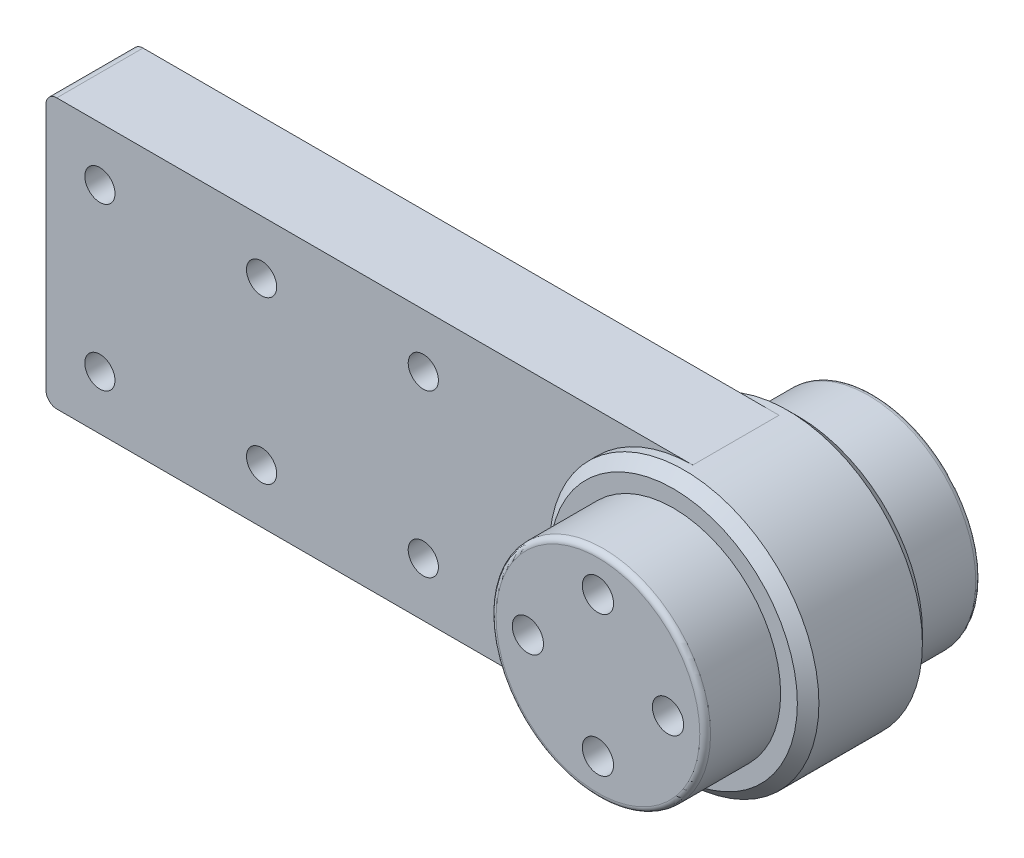
ISO-10303-21;
HEADER;
FILE_DESCRIPTION(('STEP AP214'),'2;1');
FILE_NAME('part.step','',(''),(''),'','','');
FILE_SCHEMA(('AUTOMOTIVE_DESIGN { 1 0 10303 214 1 1 1 1 }'));
ENDSEC;
DATA;
#1=APPLICATION_CONTEXT('core data for automotive mechanical design processes');
#2=APPLICATION_PROTOCOL_DEFINITION('international standard','automotive_design',2000,#1);
#3=PRODUCT_CONTEXT('',#1,'mechanical');
#4=PRODUCT('Part','Part','',(#3));
#5=PRODUCT_RELATED_PRODUCT_CATEGORY('part','',(#4));
#6=PRODUCT_DEFINITION_FORMATION('','',#4);
#7=PRODUCT_DEFINITION_CONTEXT('part definition',#1,'design');
#8=PRODUCT_DEFINITION('design','',#6,#7);
#9=PRODUCT_DEFINITION_SHAPE('','',#8);
#10=(LENGTH_UNIT() NAMED_UNIT(*) SI_UNIT(.MILLI.,.METRE.));
#11=(NAMED_UNIT(*) PLANE_ANGLE_UNIT() SI_UNIT($,.RADIAN.));
#12=(NAMED_UNIT(*) SI_UNIT($,.STERADIAN.) SOLID_ANGLE_UNIT());
#13=UNCERTAINTY_MEASURE_WITH_UNIT(LENGTH_MEASURE(1.E-05),#10,'distance_accuracy_value','');
#14=(GEOMETRIC_REPRESENTATION_CONTEXT(3) GLOBAL_UNCERTAINTY_ASSIGNED_CONTEXT((#13)) GLOBAL_UNIT_ASSIGNED_CONTEXT((#10,
#11,#12)) REPRESENTATION_CONTEXT('',''));
#15=CARTESIAN_POINT('',(0.,0.,0.));
#16=DIRECTION('',(0.,0.,1.));
#17=DIRECTION('',(1.,0.,0.));
#18=AXIS2_PLACEMENT_3D('',#15,#16,#17);
#19=CARTESIAN_POINT('',(9.95,0.,1.8));
#20=DIRECTION('',(0.,0.,-1.));
#21=DIRECTION('',(-1.,0.,0.));
#22=AXIS2_PLACEMENT_3D('',#19,#20,#21);
#23=PLANE('',#22);
#24=CARTESIAN_POINT('',(0.,0.,1.8));
#25=DIRECTION('',(0.,0.,-1.));
#26=DIRECTION('',(-1.,0.,0.));
#27=AXIS2_PLACEMENT_3D('',#24,#25,#26);
#28=CIRCLE('',#27,11.5);
#29=CARTESIAN_POINT('',(-11.5,0.,1.8));
#30=VERTEX_POINT('',#29);
#31=EDGE_CURVE('E155',#30,#30,#28,.T.);
#32=ORIENTED_EDGE('',*,*,#31,.F.);
#33=EDGE_LOOP('',(#32));
#34=FACE_BOUND('',#33,.T.);
#35=CARTESIAN_POINT('',(0.,0.,1.8));
#36=DIRECTION('',(0.,0.,-1.));
#37=DIRECTION('',(-1.,0.,0.));
#38=AXIS2_PLACEMENT_3D('',#35,#36,#37);
#39=CIRCLE('',#38,9.95);
#40=CARTESIAN_POINT('',(-9.95,0.,1.8));
#41=VERTEX_POINT('',#40);
#42=EDGE_CURVE('E146',#41,#41,#39,.T.);
#43=ORIENTED_EDGE('',*,*,#42,.T.);
#44=EDGE_LOOP('',(#43));
#45=FACE_BOUND('',#44,.T.);
#46=ADVANCED_FACE('F37',(#34,#45),#23,.F.);
#47=CARTESIAN_POINT('',(0.,0.,1.8));
#48=DIRECTION('',(0.,0.,-1.));
#49=DIRECTION('',(-1.,0.,0.));
#50=AXIS2_PLACEMENT_3D('',#47,#48,#49);
#51=CONICAL_SURFACE('',#50,11.5,0.785398163397449);
#52=CARTESIAN_POINT('',(0.,0.,0.800000000000002));
#53=DIRECTION('',(0.,0.,-1.));
#54=DIRECTION('',(-1.,0.,0.));
#55=AXIS2_PLACEMENT_3D('',#52,#53,#54);
#56=CIRCLE('',#55,12.5);
#57=CARTESIAN_POINT('',(-12.5,0.,0.800000000000003));
#58=VERTEX_POINT('',#57);
#59=EDGE_CURVE('E152',#58,#58,#56,.T.);
#60=ORIENTED_EDGE('',*,*,#59,.F.);
#61=EDGE_LOOP('',(#60));
#62=FACE_BOUND('',#61,.T.);
#63=ORIENTED_EDGE('',*,*,#31,.T.);
#64=EDGE_LOOP('',(#63));
#65=FACE_BOUND('',#64,.T.);
#66=ADVANCED_FACE('F214',(#62,#65),#51,.T.);
#67=CARTESIAN_POINT('',(0.,0.,0.));
#68=DIRECTION('',(0.,0.,-1.));
#69=DIRECTION('',(-1.,0.,0.));
#70=AXIS2_PLACEMENT_3D('',#67,#68,#69);
#71=CYLINDRICAL_SURFACE('',#70,12.5);
#72=CARTESIAN_POINT('',(0.,0.,0.));
#73=DIRECTION('',(0.,0.,-1.));
#74=DIRECTION('',(-1.,0.,0.));
#75=AXIS2_PLACEMENT_3D('',#72,#73,#74);
#76=CIRCLE('',#75,12.5);
#77=CARTESIAN_POINT('',(0.,-12.5,0.));
#78=VERTEX_POINT('',#77);
#79=CARTESIAN_POINT('',(0.,12.5,0.));
#80=VERTEX_POINT('',#79);
#81=EDGE_CURVE('E150',#78,#80,#76,.T.);
#82=ORIENTED_EDGE('',*,*,#81,.F.);
#83=DIRECTION('',(0.,0.,1.));
#84=VECTOR('',#83,1.);
#85=CARTESIAN_POINT('',(0.,-12.5,-4.));
#86=LINE('',#85,#84);
#87=CARTESIAN_POINT('',(0.,-12.5,-8.));
#88=VERTEX_POINT('',#87);
#89=EDGE_CURVE('E103',#88,#78,#86,.T.);
#90=ORIENTED_EDGE('',*,*,#89,.F.);
#91=CARTESIAN_POINT('',(0.,0.,-8.));
#92=DIRECTION('',(0.,0.,-1.));
#93=DIRECTION('',(-1.,0.,0.));
#94=AXIS2_PLACEMENT_3D('',#91,#92,#93);
#95=CIRCLE('',#94,12.5);
#96=CARTESIAN_POINT('',(0.,12.5,-8.));
#97=VERTEX_POINT('',#96);
#98=EDGE_CURVE('E108',#88,#97,#95,.T.);
#99=ORIENTED_EDGE('',*,*,#98,.T.);
#100=DIRECTION('',(0.,0.,1.));
#101=VECTOR('',#100,1.);
#102=CARTESIAN_POINT('',(0.,12.5,-4.));
#103=LINE('',#102,#101);
#104=EDGE_CURVE('E93',#97,#80,#103,.T.);
#105=ORIENTED_EDGE('',*,*,#104,.T.);
#106=EDGE_LOOP('',(#82,#90,#99,#105));
#107=FACE_BOUND('',#106,.T.);
#108=ORIENTED_EDGE('',*,*,#59,.T.);
#109=EDGE_LOOP('',(#108));
#110=FACE_BOUND('',#109,.T.);
#111=CARTESIAN_POINT('',(0.,0.,-8.8));
#112=DIRECTION('',(0.,0.,-1.));
#113=DIRECTION('',(-1.,0.,0.));
#114=AXIS2_PLACEMENT_3D('',#111,#112,#113);
#115=CIRCLE('',#114,12.5);
#116=CARTESIAN_POINT('',(-12.5,0.,-8.8));
#117=VERTEX_POINT('',#116);
#118=EDGE_CURVE('E116',#117,#117,#115,.T.);
#119=ORIENTED_EDGE('',*,*,#118,.F.);
#120=EDGE_LOOP('',(#119));
#121=FACE_BOUND('',#120,.T.);
#122=ADVANCED_FACE('F113',(#107,#110,#121),#71,.T.);
#123=CARTESIAN_POINT('',(9.95,0.,8.8));
#124=DIRECTION('',(0.,0.,-1.));
#125=DIRECTION('',(-1.,0.,0.));
#126=AXIS2_PLACEMENT_3D('',#123,#124,#125);
#127=PLANE('',#126);
#128=CARTESIAN_POINT('',(0.,0.,8.8));
#129=DIRECTION('',(0.,0.,-1.));
#130=DIRECTION('',(-1.,0.,0.));
#131=AXIS2_PLACEMENT_3D('',#128,#129,#130);
#132=CIRCLE('',#131,9.45);
#133=CARTESIAN_POINT('',(-9.45,0.,8.8));
#134=VERTEX_POINT('',#133);
#135=EDGE_CURVE('E11',#134,#134,#132,.F.);
#136=ORIENTED_EDGE('',*,*,#135,.T.);
#137=EDGE_LOOP('',(#136));
#138=FACE_BOUND('',#137,.T.);
#139=CARTESIAN_POINT('',(0.,6.5,8.8));
#140=DIRECTION('',(0.,0.,1.));
#141=DIRECTION('',(1.,0.,0.));
#142=AXIS2_PLACEMENT_3D('',#139,#140,#141);
#143=CIRCLE('',#142,1.45);
#144=CARTESIAN_POINT('',(1.45,6.5,8.8));
#145=VERTEX_POINT('',#144);
#146=EDGE_CURVE('E130',#145,#145,#143,.T.);
#147=ORIENTED_EDGE('',*,*,#146,.F.);
#148=EDGE_LOOP('',(#147));
#149=FACE_BOUND('',#148,.T.);
#150=CARTESIAN_POINT('',(6.5,0.,8.8));
#151=DIRECTION('',(0.,0.,1.));
#152=DIRECTION('',(1.,0.,0.));
#153=AXIS2_PLACEMENT_3D('',#150,#151,#152);
#154=CIRCLE('',#153,1.45);
#155=CARTESIAN_POINT('',(7.95,0.,8.8));
#156=VERTEX_POINT('',#155);
#157=EDGE_CURVE('E133',#156,#156,#154,.T.);
#158=ORIENTED_EDGE('',*,*,#157,.F.);
#159=EDGE_LOOP('',(#158));
#160=FACE_BOUND('',#159,.T.);
#161=CARTESIAN_POINT('',(0.,-6.5,8.8));
#162=DIRECTION('',(0.,0.,1.));
#163=DIRECTION('',(1.,0.,0.));
#164=AXIS2_PLACEMENT_3D('',#161,#162,#163);
#165=CIRCLE('',#164,1.45);
#166=CARTESIAN_POINT('',(1.45,-6.5,8.8));
#167=VERTEX_POINT('',#166);
#168=EDGE_CURVE('E136',#167,#167,#165,.T.);
#169=ORIENTED_EDGE('',*,*,#168,.F.);
#170=EDGE_LOOP('',(#169));
#171=FACE_BOUND('',#170,.T.);
#172=CARTESIAN_POINT('',(-6.5,0.,8.8));
#173=DIRECTION('',(0.,0.,1.));
#174=DIRECTION('',(1.,0.,0.));
#175=AXIS2_PLACEMENT_3D('',#172,#173,#174);
#176=CIRCLE('',#175,1.45);
#177=CARTESIAN_POINT('',(-5.05,0.,8.8));
#178=VERTEX_POINT('',#177);
#179=EDGE_CURVE('E129',#178,#178,#176,.T.);
#180=ORIENTED_EDGE('',*,*,#179,.F.);
#181=EDGE_LOOP('',(#180));
#182=FACE_BOUND('',#181,.T.);
#183=ADVANCED_FACE('F339',(#138,#149,#160,#171,#182),#127,.F.);
#184=CARTESIAN_POINT('',(0.,0.,0.));
#185=DIRECTION('',(0.,0.,-1.));
#186=DIRECTION('',(-1.,0.,0.));
#187=AXIS2_PLACEMENT_3D('',#184,#185,#186);
#188=CYLINDRICAL_SURFACE('',#187,9.95);
#189=CARTESIAN_POINT('',(0.,0.,8.3));
#190=DIRECTION('',(0.,0.,-1.));
#191=DIRECTION('',(-1.,0.,0.));
#192=AXIS2_PLACEMENT_3D('',#189,#190,#191);
#193=CIRCLE('',#192,9.95);
#194=CARTESIAN_POINT('',(-9.95,0.,8.3));
#195=VERTEX_POINT('',#194);
#196=EDGE_CURVE('E45',#195,#195,#193,.T.);
#197=ORIENTED_EDGE('',*,*,#196,.T.);
#198=EDGE_LOOP('',(#197));
#199=FACE_BOUND('',#198,.T.);
#200=ORIENTED_EDGE('',*,*,#42,.F.);
#201=EDGE_LOOP('',(#200));
#202=FACE_BOUND('',#201,.T.);
#203=ADVANCED_FACE('F201',(#199,#202),#188,.T.);
#204=CARTESIAN_POINT('',(-60.,-12.5,-4.));
#205=DIRECTION('',(0.,-1.,0.));
#206=DIRECTION('',(1.,0.,0.));
#207=AXIS2_PLACEMENT_3D('',#204,#205,#206);
#208=PLANE('',#207);
#209=DIRECTION('',(1.,0.,0.));
#210=VECTOR('',#209,1.);
#211=CARTESIAN_POINT('',(-60.,-12.5,0.));
#212=LINE('',#211,#210);
#213=CARTESIAN_POINT('',(-59.,-12.5,0.));
#214=VERTEX_POINT('',#213);
#215=EDGE_CURVE('E104',#214,#78,#212,.T.);
#216=ORIENTED_EDGE('',*,*,#215,.F.);
#217=DIRECTION('',(0.,0.,1.));
#218=VECTOR('',#217,1.);
#219=CARTESIAN_POINT('',(-59.,-12.5,-4.));
#220=LINE('',#219,#218);
#221=CARTESIAN_POINT('',(-59.,-12.5,-8.));
#222=VERTEX_POINT('',#221);
#223=EDGE_CURVE('E60',#214,#222,#220,.F.);
#224=ORIENTED_EDGE('',*,*,#223,.T.);
#225=DIRECTION('',(1.,0.,0.));
#226=VECTOR('',#225,1.);
#227=CARTESIAN_POINT('',(-60.,-12.5,-8.));
#228=LINE('',#227,#226);
#229=EDGE_CURVE('E123',#222,#88,#228,.T.);
#230=ORIENTED_EDGE('',*,*,#229,.T.);
#231=ORIENTED_EDGE('',*,*,#89,.T.);
#232=EDGE_LOOP('',(#216,#224,#230,#231));
#233=FACE_BOUND('',#232,.T.);
#234=ADVANCED_FACE('F239',(#233),#208,.T.);
#235=CARTESIAN_POINT('',(-60.,12.5,-4.));
#236=DIRECTION('',(-1.,0.,0.));
#237=DIRECTION('',(0.,0.,1.));
#238=AXIS2_PLACEMENT_3D('',#235,#236,#237);
#239=PLANE('',#238);
#240=DIRECTION('',(0.,-1.,0.));
#241=VECTOR('',#240,1.);
#242=CARTESIAN_POINT('',(-60.,12.5,-8.));
#243=LINE('',#242,#241);
#244=CARTESIAN_POINT('',(-60.,11.5,-8.));
#245=VERTEX_POINT('',#244);
#246=CARTESIAN_POINT('',(-60.,-11.5,-8.));
#247=VERTEX_POINT('',#246);
#248=EDGE_CURVE('E109',#245,#247,#243,.T.);
#249=ORIENTED_EDGE('',*,*,#248,.T.);
#250=DIRECTION('',(0.,0.,1.));
#251=VECTOR('',#250,1.);
#252=CARTESIAN_POINT('',(-60.,-11.5,-4.));
#253=LINE('',#252,#251);
#254=CARTESIAN_POINT('',(-60.,-11.5,0.));
#255=VERTEX_POINT('',#254);
#256=EDGE_CURVE('E180',#247,#255,#253,.T.);
#257=ORIENTED_EDGE('',*,*,#256,.T.);
#258=DIRECTION('',(0.,-1.,0.));
#259=VECTOR('',#258,1.);
#260=CARTESIAN_POINT('',(-60.,12.5,0.));
#261=LINE('',#260,#259);
#262=CARTESIAN_POINT('',(-60.,11.5,0.));
#263=VERTEX_POINT('',#262);
#264=EDGE_CURVE('E142',#263,#255,#261,.T.);
#265=ORIENTED_EDGE('',*,*,#264,.F.);
#266=DIRECTION('',(0.,0.,1.));
#267=VECTOR('',#266,1.);
#268=CARTESIAN_POINT('',(-60.,11.5,-4.));
#269=LINE('',#268,#267);
#270=EDGE_CURVE('E158',#263,#245,#269,.F.);
#271=ORIENTED_EDGE('',*,*,#270,.T.);
#272=EDGE_LOOP('',(#249,#257,#265,#271));
#273=FACE_BOUND('',#272,.T.);
#274=ADVANCED_FACE('F331',(#273),#239,.T.);
#275=CARTESIAN_POINT('',(0.,12.5,-4.));
#276=DIRECTION('',(0.,1.,0.));
#277=DIRECTION('',(-1.,0.,0.));
#278=AXIS2_PLACEMENT_3D('',#275,#276,#277);
#279=PLANE('',#278);
#280=DIRECTION('',(-1.,0.,0.));
#281=VECTOR('',#280,1.);
#282=CARTESIAN_POINT('',(0.,12.5,-8.));
#283=LINE('',#282,#281);
#284=CARTESIAN_POINT('',(-59.,12.5,-8.));
#285=VERTEX_POINT('',#284);
#286=EDGE_CURVE('E96',#97,#285,#283,.T.);
#287=ORIENTED_EDGE('',*,*,#286,.T.);
#288=DIRECTION('',(0.,0.,1.));
#289=VECTOR('',#288,1.);
#290=CARTESIAN_POINT('',(-59.,12.5,-4.));
#291=LINE('',#290,#289);
#292=CARTESIAN_POINT('',(-59.,12.5,0.));
#293=VERTEX_POINT('',#292);
#294=EDGE_CURVE('E191',#285,#293,#291,.T.);
#295=ORIENTED_EDGE('',*,*,#294,.T.);
#296=DIRECTION('',(-1.,0.,0.));
#297=VECTOR('',#296,1.);
#298=CARTESIAN_POINT('',(0.,12.5,0.));
#299=LINE('',#298,#297);
#300=EDGE_CURVE('E99',#80,#293,#299,.T.);
#301=ORIENTED_EDGE('',*,*,#300,.F.);
#302=ORIENTED_EDGE('',*,*,#104,.F.);
#303=EDGE_LOOP('',(#287,#295,#301,#302));
#304=FACE_BOUND('',#303,.T.);
#305=ADVANCED_FACE('F94',(#304),#279,.T.);
#306=CARTESIAN_POINT('',(0.,0.,0.));
#307=DIRECTION('',(0.,0.,1.));
#308=DIRECTION('',(1.,0.,0.));
#309=AXIS2_PLACEMENT_3D('',#306,#307,#308);
#310=PLANE('',#309);
#311=CARTESIAN_POINT('',(-25.,7.5,0.));
#312=DIRECTION('',(0.,0.,1.));
#313=DIRECTION('',(1.,0.,0.));
#314=AXIS2_PLACEMENT_3D('',#311,#312,#313);
#315=CIRCLE('',#314,1.4);
#316=CARTESIAN_POINT('',(-23.6,7.5,0.));
#317=VERTEX_POINT('',#316);
#318=EDGE_CURVE('E263',#317,#317,#315,.T.);
#319=ORIENTED_EDGE('',*,*,#318,.F.);
#320=EDGE_LOOP('',(#319));
#321=FACE_BOUND('',#320,.T.);
#322=CARTESIAN_POINT('',(-40.,-7.49999999999999,0.));
#323=DIRECTION('',(0.,0.,1.));
#324=DIRECTION('',(1.,0.,0.));
#325=AXIS2_PLACEMENT_3D('',#322,#323,#324);
#326=CIRCLE('',#325,1.4);
#327=CARTESIAN_POINT('',(-38.6,-7.49999999999999,0.));
#328=VERTEX_POINT('',#327);
#329=EDGE_CURVE('E260',#328,#328,#326,.T.);
#330=ORIENTED_EDGE('',*,*,#329,.F.);
#331=EDGE_LOOP('',(#330));
#332=FACE_BOUND('',#331,.T.);
#333=CARTESIAN_POINT('',(-40.,7.5,0.));
#334=DIRECTION('',(0.,0.,1.));
#335=DIRECTION('',(1.,0.,0.));
#336=AXIS2_PLACEMENT_3D('',#333,#334,#335);
#337=CIRCLE('',#336,1.4);
#338=CARTESIAN_POINT('',(-38.6,7.5,0.));
#339=VERTEX_POINT('',#338);
#340=EDGE_CURVE('E257',#339,#339,#337,.T.);
#341=ORIENTED_EDGE('',*,*,#340,.F.);
#342=EDGE_LOOP('',(#341));
#343=FACE_BOUND('',#342,.T.);
#344=CARTESIAN_POINT('',(-55.,-7.49999999999999,0.));
#345=DIRECTION('',(0.,0.,1.));
#346=DIRECTION('',(1.,0.,0.));
#347=AXIS2_PLACEMENT_3D('',#344,#345,#346);
#348=CIRCLE('',#347,1.4);
#349=CARTESIAN_POINT('',(-53.6,-7.49999999999999,0.));
#350=VERTEX_POINT('',#349);
#351=EDGE_CURVE('E256',#350,#350,#348,.T.);
#352=ORIENTED_EDGE('',*,*,#351,.F.);
#353=EDGE_LOOP('',(#352));
#354=FACE_BOUND('',#353,.T.);
#355=CARTESIAN_POINT('',(-25.,-7.49999999999999,0.));
#356=DIRECTION('',(0.,0.,1.));
#357=DIRECTION('',(1.,0.,0.));
#358=AXIS2_PLACEMENT_3D('',#355,#356,#357);
#359=CIRCLE('',#358,1.4);
#360=CARTESIAN_POINT('',(-23.6,-7.49999999999999,0.));
#361=VERTEX_POINT('',#360);
#362=EDGE_CURVE('E266',#361,#361,#359,.T.);
#363=ORIENTED_EDGE('',*,*,#362,.F.);
#364=EDGE_LOOP('',(#363));
#365=FACE_BOUND('',#364,.T.);
#366=CARTESIAN_POINT('',(-55.,7.5,0.));
#367=DIRECTION('',(0.,0.,1.));
#368=DIRECTION('',(1.,0.,0.));
#369=AXIS2_PLACEMENT_3D('',#366,#367,#368);
#370=CIRCLE('',#369,1.4);
#371=CARTESIAN_POINT('',(-53.6,7.5,0.));
#372=VERTEX_POINT('',#371);
#373=EDGE_CURVE('E163',#372,#372,#370,.T.);
#374=ORIENTED_EDGE('',*,*,#373,.F.);
#375=EDGE_LOOP('',(#374));
#376=FACE_BOUND('',#375,.T.);
#377=ORIENTED_EDGE('',*,*,#264,.T.);
#378=CARTESIAN_POINT('',(-59.,-11.5,0.));
#379=DIRECTION('',(0.,0.,1.));
#380=DIRECTION('',(1.,0.,0.));
#381=AXIS2_PLACEMENT_3D('',#378,#379,#380);
#382=CIRCLE('',#381,1.);
#383=EDGE_CURVE('E185',#255,#214,#382,.T.);
#384=ORIENTED_EDGE('',*,*,#383,.T.);
#385=ORIENTED_EDGE('',*,*,#215,.T.);
#386=ORIENTED_EDGE('',*,*,#81,.T.);
#387=ORIENTED_EDGE('',*,*,#300,.T.);
#388=CARTESIAN_POINT('',(-59.,11.5,0.));
#389=DIRECTION('',(0.,0.,1.));
#390=DIRECTION('',(1.,0.,0.));
#391=AXIS2_PLACEMENT_3D('',#388,#389,#390);
#392=CIRCLE('',#391,1.);
#393=EDGE_CURVE('E183',#293,#263,#392,.T.);
#394=ORIENTED_EDGE('',*,*,#393,.T.);
#395=EDGE_LOOP('',(#377,#384,#385,#386,#387,#394));
#396=FACE_BOUND('',#395,.T.);
#397=ADVANCED_FACE('F237',(#321,#332,#343,#354,#365,#376,#396),#310,.T.);
#398=CARTESIAN_POINT('',(-6.5,0.,-4.));
#399=DIRECTION('',(0.,0.,1.));
#400=DIRECTION('',(1.,0.,0.));
#401=AXIS2_PLACEMENT_3D('',#398,#399,#400);
#402=CYLINDRICAL_SURFACE('',#401,1.45);
#403=ORIENTED_EDGE('',*,*,#179,.T.);
#404=EDGE_LOOP('',(#403));
#405=FACE_BOUND('',#404,.T.);
#406=CARTESIAN_POINT('',(-6.5,0.,-16.8));
#407=DIRECTION('',(0.,0.,1.));
#408=DIRECTION('',(1.,0.,0.));
#409=AXIS2_PLACEMENT_3D('',#406,#407,#408);
#410=CIRCLE('',#409,1.45);
#411=CARTESIAN_POINT('',(-5.05,0.,-16.8));
#412=VERTEX_POINT('',#411);
#413=EDGE_CURVE('E178',#412,#412,#410,.T.);
#414=ORIENTED_EDGE('',*,*,#413,.F.);
#415=EDGE_LOOP('',(#414));
#416=FACE_BOUND('',#415,.T.);
#417=ADVANCED_FACE('F276',(#405,#416),#402,.F.);
#418=CARTESIAN_POINT('',(0.,-6.5,-4.));
#419=DIRECTION('',(0.,0.,1.));
#420=DIRECTION('',(1.,0.,0.));
#421=AXIS2_PLACEMENT_3D('',#418,#419,#420);
#422=CYLINDRICAL_SURFACE('',#421,1.45);
#423=ORIENTED_EDGE('',*,*,#168,.T.);
#424=EDGE_LOOP('',(#423));
#425=FACE_BOUND('',#424,.T.);
#426=CARTESIAN_POINT('',(0.,-6.5,-16.8));
#427=DIRECTION('',(0.,0.,1.));
#428=DIRECTION('',(1.,0.,0.));
#429=AXIS2_PLACEMENT_3D('',#426,#427,#428);
#430=CIRCLE('',#429,1.45);
#431=CARTESIAN_POINT('',(1.45,-6.5,-16.8));
#432=VERTEX_POINT('',#431);
#433=EDGE_CURVE('E246',#432,#432,#430,.T.);
#434=ORIENTED_EDGE('',*,*,#433,.F.);
#435=EDGE_LOOP('',(#434));
#436=FACE_BOUND('',#435,.T.);
#437=ADVANCED_FACE('F321',(#425,#436),#422,.F.);
#438=CARTESIAN_POINT('',(6.5,0.,-4.));
#439=DIRECTION('',(0.,0.,1.));
#440=DIRECTION('',(1.,0.,0.));
#441=AXIS2_PLACEMENT_3D('',#438,#439,#440);
#442=CYLINDRICAL_SURFACE('',#441,1.45);
#443=ORIENTED_EDGE('',*,*,#157,.T.);
#444=EDGE_LOOP('',(#443));
#445=FACE_BOUND('',#444,.T.);
#446=CARTESIAN_POINT('',(6.5,0.,-16.8));
#447=DIRECTION('',(0.,0.,1.));
#448=DIRECTION('',(1.,0.,0.));
#449=AXIS2_PLACEMENT_3D('',#446,#447,#448);
#450=CIRCLE('',#449,1.45);
#451=CARTESIAN_POINT('',(7.95,0.,-16.8));
#452=VERTEX_POINT('',#451);
#453=EDGE_CURVE('E249',#452,#452,#450,.T.);
#454=ORIENTED_EDGE('',*,*,#453,.F.);
#455=EDGE_LOOP('',(#454));
#456=FACE_BOUND('',#455,.T.);
#457=ADVANCED_FACE('F317',(#445,#456),#442,.F.);
#458=CARTESIAN_POINT('',(0.,6.5,-4.));
#459=DIRECTION('',(0.,0.,1.));
#460=DIRECTION('',(1.,0.,0.));
#461=AXIS2_PLACEMENT_3D('',#458,#459,#460);
#462=CYLINDRICAL_SURFACE('',#461,1.45);
#463=ORIENTED_EDGE('',*,*,#146,.T.);
#464=EDGE_LOOP('',(#463));
#465=FACE_BOUND('',#464,.T.);
#466=CARTESIAN_POINT('',(0.,6.5,-16.8));
#467=DIRECTION('',(0.,0.,1.));
#468=DIRECTION('',(1.,0.,0.));
#469=AXIS2_PLACEMENT_3D('',#466,#467,#468);
#470=CIRCLE('',#469,1.45);
#471=CARTESIAN_POINT('',(1.45,6.5,-16.8));
#472=VERTEX_POINT('',#471);
#473=EDGE_CURVE('E110',#472,#472,#470,.T.);
#474=ORIENTED_EDGE('',*,*,#473,.F.);
#475=EDGE_LOOP('',(#474));
#476=FACE_BOUND('',#475,.T.);
#477=ADVANCED_FACE('F313',(#465,#476),#462,.F.);
#478=CARTESIAN_POINT('',(9.95,0.,-9.8));
#479=DIRECTION('',(0.,0.,1.));
#480=DIRECTION('',(-1.,0.,0.));
#481=AXIS2_PLACEMENT_3D('',#478,#479,#480);
#482=PLANE('',#481);
#483=CARTESIAN_POINT('',(0.,0.,-9.8));
#484=DIRECTION('',(0.,0.,-1.));
#485=DIRECTION('',(-1.,0.,0.));
#486=AXIS2_PLACEMENT_3D('',#483,#484,#485);
#487=CIRCLE('',#486,11.5);
#488=CARTESIAN_POINT('',(-11.5,0.,-9.8));
#489=VERTEX_POINT('',#488);
#490=EDGE_CURVE('E120',#489,#489,#487,.T.);
#491=ORIENTED_EDGE('',*,*,#490,.T.);
#492=EDGE_LOOP('',(#491));
#493=FACE_BOUND('',#492,.T.);
#494=CARTESIAN_POINT('',(0.,0.,-9.8));
#495=DIRECTION('',(0.,0.,-1.));
#496=DIRECTION('',(-1.,0.,0.));
#497=AXIS2_PLACEMENT_3D('',#494,#495,#496);
#498=CIRCLE('',#497,9.95);
#499=CARTESIAN_POINT('',(-9.95,0.,-9.8));
#500=VERTEX_POINT('',#499);
#501=EDGE_CURVE('E117',#500,#500,#498,.T.);
#502=ORIENTED_EDGE('',*,*,#501,.F.);
#503=EDGE_LOOP('',(#502));
#504=FACE_BOUND('',#503,.T.);
#505=ADVANCED_FACE('F309',(#493,#504),#482,.F.);
#506=CARTESIAN_POINT('',(0.,0.,-9.8));
#507=DIRECTION('',(0.,0.,1.));
#508=DIRECTION('',(-1.,0.,0.));
#509=AXIS2_PLACEMENT_3D('',#506,#507,#508);
#510=CONICAL_SURFACE('',#509,11.5,0.785398163397449);
#511=ORIENTED_EDGE('',*,*,#118,.T.);
#512=EDGE_LOOP('',(#511));
#513=FACE_BOUND('',#512,.T.);
#514=ORIENTED_EDGE('',*,*,#490,.F.);
#515=EDGE_LOOP('',(#514));
#516=FACE_BOUND('',#515,.T.);
#517=ADVANCED_FACE('F305',(#513,#516),#510,.T.);
#518=CARTESIAN_POINT('',(9.95,0.,-16.8));
#519=DIRECTION('',(0.,0.,1.));
#520=DIRECTION('',(-1.,0.,0.));
#521=AXIS2_PLACEMENT_3D('',#518,#519,#520);
#522=PLANE('',#521);
#523=CARTESIAN_POINT('',(0.,0.,-16.8));
#524=DIRECTION('',(0.,0.,1.));
#525=DIRECTION('',(1.,0.,0.));
#526=AXIS2_PLACEMENT_3D('',#523,#524,#525);
#527=CIRCLE('',#526,9.45);
#528=CARTESIAN_POINT('',(9.45,0.,-16.8));
#529=VERTEX_POINT('',#528);
#530=EDGE_CURVE('E193',#529,#529,#527,.F.);
#531=ORIENTED_EDGE('',*,*,#530,.T.);
#532=EDGE_LOOP('',(#531));
#533=FACE_BOUND('',#532,.T.);
#534=ORIENTED_EDGE('',*,*,#473,.T.);
#535=EDGE_LOOP('',(#534));
#536=FACE_BOUND('',#535,.T.);
#537=ORIENTED_EDGE('',*,*,#453,.T.);
#538=EDGE_LOOP('',(#537));
#539=FACE_BOUND('',#538,.T.);
#540=ORIENTED_EDGE('',*,*,#433,.T.);
#541=EDGE_LOOP('',(#540));
#542=FACE_BOUND('',#541,.T.);
#543=ORIENTED_EDGE('',*,*,#413,.T.);
#544=EDGE_LOOP('',(#543));
#545=FACE_BOUND('',#544,.T.);
#546=ADVANCED_FACE('F301',(#533,#536,#539,#542,#545),#522,.F.);
#547=CARTESIAN_POINT('',(0.,0.,-8.));
#548=DIRECTION('',(0.,0.,1.));
#549=DIRECTION('',(-1.,0.,0.));
#550=AXIS2_PLACEMENT_3D('',#547,#548,#549);
#551=CYLINDRICAL_SURFACE('',#550,9.95);
#552=CARTESIAN_POINT('',(0.,0.,-16.3));
#553=DIRECTION('',(0.,0.,1.));
#554=DIRECTION('',(1.,0.,0.));
#555=AXIS2_PLACEMENT_3D('',#552,#553,#554);
#556=CIRCLE('',#555,9.95);
#557=CARTESIAN_POINT('',(9.95,0.,-16.3));
#558=VERTEX_POINT('',#557);
#559=EDGE_CURVE('E196',#558,#558,#556,.T.);
#560=ORIENTED_EDGE('',*,*,#559,.T.);
#561=EDGE_LOOP('',(#560));
#562=FACE_BOUND('',#561,.T.);
#563=ORIENTED_EDGE('',*,*,#501,.T.);
#564=EDGE_LOOP('',(#563));
#565=FACE_BOUND('',#564,.T.);
#566=ADVANCED_FACE('F292',(#562,#565),#551,.T.);
#567=CARTESIAN_POINT('',(0.,0.,-8.));
#568=DIRECTION('',(0.,0.,-1.));
#569=DIRECTION('',(1.,0.,0.));
#570=AXIS2_PLACEMENT_3D('',#567,#568,#569);
#571=PLANE('',#570);
#572=CARTESIAN_POINT('',(-25.,7.5,-8.));
#573=DIRECTION('',(0.,0.,-1.));
#574=DIRECTION('',(-1.,0.,0.));
#575=AXIS2_PLACEMENT_3D('',#572,#573,#574);
#576=CIRCLE('',#575,1.4);
#577=CARTESIAN_POINT('',(-26.4,7.5,-8.));
#578=VERTEX_POINT('',#577);
#579=EDGE_CURVE('E175',#578,#578,#576,.T.);
#580=ORIENTED_EDGE('',*,*,#579,.F.);
#581=EDGE_LOOP('',(#580));
#582=FACE_BOUND('',#581,.T.);
#583=CARTESIAN_POINT('',(-40.,-7.49999999999999,-8.));
#584=DIRECTION('',(0.,0.,-1.));
#585=DIRECTION('',(-1.,0.,0.));
#586=AXIS2_PLACEMENT_3D('',#583,#584,#585);
#587=CIRCLE('',#586,1.4);
#588=CARTESIAN_POINT('',(-41.4,-7.49999999999999,-8.));
#589=VERTEX_POINT('',#588);
#590=EDGE_CURVE('E172',#589,#589,#587,.T.);
#591=ORIENTED_EDGE('',*,*,#590,.F.);
#592=EDGE_LOOP('',(#591));
#593=FACE_BOUND('',#592,.T.);
#594=CARTESIAN_POINT('',(-40.,7.5,-8.));
#595=DIRECTION('',(0.,0.,-1.));
#596=DIRECTION('',(-1.,0.,0.));
#597=AXIS2_PLACEMENT_3D('',#594,#595,#596);
#598=CIRCLE('',#597,1.4);
#599=CARTESIAN_POINT('',(-41.4,7.5,-8.));
#600=VERTEX_POINT('',#599);
#601=EDGE_CURVE('E169',#600,#600,#598,.T.);
#602=ORIENTED_EDGE('',*,*,#601,.F.);
#603=EDGE_LOOP('',(#602));
#604=FACE_BOUND('',#603,.T.);
#605=CARTESIAN_POINT('',(-55.,-7.49999999999999,-8.));
#606=DIRECTION('',(0.,0.,-1.));
#607=DIRECTION('',(-1.,0.,0.));
#608=AXIS2_PLACEMENT_3D('',#605,#606,#607);
#609=CIRCLE('',#608,1.4);
#610=CARTESIAN_POINT('',(-56.4,-7.49999999999999,-8.));
#611=VERTEX_POINT('',#610);
#612=EDGE_CURVE('E166',#611,#611,#609,.T.);
#613=ORIENTED_EDGE('',*,*,#612,.F.);
#614=EDGE_LOOP('',(#613));
#615=FACE_BOUND('',#614,.T.);
#616=CARTESIAN_POINT('',(-25.,-7.49999999999999,-8.));
#617=DIRECTION('',(0.,0.,-1.));
#618=DIRECTION('',(-1.,0.,0.));
#619=AXIS2_PLACEMENT_3D('',#616,#617,#618);
#620=CIRCLE('',#619,1.4);
#621=CARTESIAN_POINT('',(-26.4,-7.49999999999999,-8.));
#622=VERTEX_POINT('',#621);
#623=EDGE_CURVE('E162',#622,#622,#620,.T.);
#624=ORIENTED_EDGE('',*,*,#623,.F.);
#625=EDGE_LOOP('',(#624));
#626=FACE_BOUND('',#625,.T.);
#627=CARTESIAN_POINT('',(-55.,7.5,-8.));
#628=DIRECTION('',(0.,0.,-1.));
#629=DIRECTION('',(-1.,0.,0.));
#630=AXIS2_PLACEMENT_3D('',#627,#628,#629);
#631=CIRCLE('',#630,1.4);
#632=CARTESIAN_POINT('',(-56.4,7.5,-8.));
#633=VERTEX_POINT('',#632);
#634=EDGE_CURVE('E159',#633,#633,#631,.T.);
#635=ORIENTED_EDGE('',*,*,#634,.F.);
#636=EDGE_LOOP('',(#635));
#637=FACE_BOUND('',#636,.T.);
#638=ORIENTED_EDGE('',*,*,#229,.F.);
#639=CARTESIAN_POINT('',(-59.,-11.5,-8.));
#640=DIRECTION('',(0.,0.,-1.));
#641=DIRECTION('',(-1.,0.,0.));
#642=AXIS2_PLACEMENT_3D('',#639,#640,#641);
#643=CIRCLE('',#642,1.);
#644=EDGE_CURVE('E189',#222,#247,#643,.T.);
#645=ORIENTED_EDGE('',*,*,#644,.T.);
#646=ORIENTED_EDGE('',*,*,#248,.F.);
#647=CARTESIAN_POINT('',(-59.,11.5,-8.));
#648=DIRECTION('',(0.,0.,-1.));
#649=DIRECTION('',(-1.,0.,0.));
#650=AXIS2_PLACEMENT_3D('',#647,#648,#649);
#651=CIRCLE('',#650,1.);
#652=EDGE_CURVE('E52',#245,#285,#651,.T.);
#653=ORIENTED_EDGE('',*,*,#652,.T.);
#654=ORIENTED_EDGE('',*,*,#286,.F.);
#655=ORIENTED_EDGE('',*,*,#98,.F.);
#656=EDGE_LOOP('',(#638,#645,#646,#653,#654,#655));
#657=FACE_BOUND('',#656,.T.);
#658=ADVANCED_FACE('F107',(#582,#593,#604,#615,#626,#637,#657),#571,.T.);
#659=CARTESIAN_POINT('',(-55.,7.5,-16.8));
#660=DIRECTION('',(0.,0.,1.));
#661=DIRECTION('',(1.,0.,0.));
#662=AXIS2_PLACEMENT_3D('',#659,#660,#661);
#663=CYLINDRICAL_SURFACE('',#662,1.4);
#664=ORIENTED_EDGE('',*,*,#634,.T.);
#665=EDGE_LOOP('',(#664));
#666=FACE_BOUND('',#665,.T.);
#667=ORIENTED_EDGE('',*,*,#373,.T.);
#668=EDGE_LOOP('',(#667));
#669=FACE_BOUND('',#668,.T.);
#670=ADVANCED_FACE('F281',(#666,#669),#663,.F.);
#671=CARTESIAN_POINT('',(-25.,-7.49999999999999,-16.8));
#672=DIRECTION('',(0.,0.,1.));
#673=DIRECTION('',(1.,0.,0.));
#674=AXIS2_PLACEMENT_3D('',#671,#672,#673);
#675=CYLINDRICAL_SURFACE('',#674,1.4);
#676=ORIENTED_EDGE('',*,*,#623,.T.);
#677=EDGE_LOOP('',(#676));
#678=FACE_BOUND('',#677,.T.);
#679=ORIENTED_EDGE('',*,*,#362,.T.);
#680=EDGE_LOOP('',(#679));
#681=FACE_BOUND('',#680,.T.);
#682=ADVANCED_FACE('F272',(#678,#681),#675,.F.);
#683=CARTESIAN_POINT('',(-55.,-7.49999999999999,-16.8));
#684=DIRECTION('',(0.,0.,1.));
#685=DIRECTION('',(1.,0.,0.));
#686=AXIS2_PLACEMENT_3D('',#683,#684,#685);
#687=CYLINDRICAL_SURFACE('',#686,1.4);
#688=ORIENTED_EDGE('',*,*,#612,.T.);
#689=EDGE_LOOP('',(#688));
#690=FACE_BOUND('',#689,.T.);
#691=ORIENTED_EDGE('',*,*,#351,.T.);
#692=EDGE_LOOP('',(#691));
#693=FACE_BOUND('',#692,.T.);
#694=ADVANCED_FACE('F289',(#690,#693),#687,.F.);
#695=CARTESIAN_POINT('',(-40.,7.5,-16.8));
#696=DIRECTION('',(0.,0.,1.));
#697=DIRECTION('',(1.,0.,0.));
#698=AXIS2_PLACEMENT_3D('',#695,#696,#697);
#699=CYLINDRICAL_SURFACE('',#698,1.4);
#700=ORIENTED_EDGE('',*,*,#601,.T.);
#701=EDGE_LOOP('',(#700));
#702=FACE_BOUND('',#701,.T.);
#703=ORIENTED_EDGE('',*,*,#340,.T.);
#704=EDGE_LOOP('',(#703));
#705=FACE_BOUND('',#704,.T.);
#706=ADVANCED_FACE('F296',(#702,#705),#699,.F.);
#707=CARTESIAN_POINT('',(-40.,-7.49999999999999,-16.8));
#708=DIRECTION('',(0.,0.,1.));
#709=DIRECTION('',(1.,0.,0.));
#710=AXIS2_PLACEMENT_3D('',#707,#708,#709);
#711=CYLINDRICAL_SURFACE('',#710,1.4);
#712=ORIENTED_EDGE('',*,*,#590,.T.);
#713=EDGE_LOOP('',(#712));
#714=FACE_BOUND('',#713,.T.);
#715=ORIENTED_EDGE('',*,*,#329,.T.);
#716=EDGE_LOOP('',(#715));
#717=FACE_BOUND('',#716,.T.);
#718=ADVANCED_FACE('F460',(#714,#717),#711,.F.);
#719=CARTESIAN_POINT('',(-25.,7.5,-16.8));
#720=DIRECTION('',(0.,0.,1.));
#721=DIRECTION('',(1.,0.,0.));
#722=AXIS2_PLACEMENT_3D('',#719,#720,#721);
#723=CYLINDRICAL_SURFACE('',#722,1.4);
#724=ORIENTED_EDGE('',*,*,#579,.T.);
#725=EDGE_LOOP('',(#724));
#726=FACE_BOUND('',#725,.T.);
#727=ORIENTED_EDGE('',*,*,#318,.T.);
#728=EDGE_LOOP('',(#727));
#729=FACE_BOUND('',#728,.T.);
#730=ADVANCED_FACE('F229',(#726,#729),#723,.F.);
#731=CARTESIAN_POINT('',(-59.,-11.5,-4.));
#732=DIRECTION('',(0.,0.,1.));
#733=DIRECTION('',(1.,0.,0.));
#734=AXIS2_PLACEMENT_3D('',#731,#732,#733);
#735=CYLINDRICAL_SURFACE('',#734,1.);
#736=ORIENTED_EDGE('',*,*,#644,.F.);
#737=ORIENTED_EDGE('',*,*,#223,.F.);
#738=ORIENTED_EDGE('',*,*,#383,.F.);
#739=ORIENTED_EDGE('',*,*,#256,.F.);
#740=EDGE_LOOP('',(#736,#737,#738,#739));
#741=FACE_BOUND('',#740,.T.);
#742=ADVANCED_FACE('F226',(#741),#735,.T.);
#743=CARTESIAN_POINT('',(-59.,11.5,-4.));
#744=DIRECTION('',(0.,0.,1.));
#745=DIRECTION('',(1.,0.,0.));
#746=AXIS2_PLACEMENT_3D('',#743,#744,#745);
#747=CYLINDRICAL_SURFACE('',#746,1.);
#748=ORIENTED_EDGE('',*,*,#652,.F.);
#749=ORIENTED_EDGE('',*,*,#270,.F.);
#750=ORIENTED_EDGE('',*,*,#393,.F.);
#751=ORIENTED_EDGE('',*,*,#294,.F.);
#752=EDGE_LOOP('',(#748,#749,#750,#751));
#753=FACE_BOUND('',#752,.T.);
#754=ADVANCED_FACE('F210',(#753),#747,.T.);
#755=CARTESIAN_POINT('',(0.,0.,-16.3));
#756=DIRECTION('',(0.,0.,1.));
#757=DIRECTION('',(1.,0.,0.));
#758=AXIS2_PLACEMENT_3D('',#755,#756,#757);
#759=TOROIDAL_SURFACE('',#758,9.45,0.5);
#760=ORIENTED_EDGE('',*,*,#559,.F.);
#761=EDGE_LOOP('',(#760));
#762=FACE_BOUND('',#761,.T.);
#763=ORIENTED_EDGE('',*,*,#530,.F.);
#764=EDGE_LOOP('',(#763));
#765=FACE_BOUND('',#764,.T.);
#766=ADVANCED_FACE('F205',(#762,#765),#759,.T.);
#767=CARTESIAN_POINT('',(0.,0.,8.3));
#768=DIRECTION('',(0.,0.,-1.));
#769=DIRECTION('',(-1.,0.,0.));
#770=AXIS2_PLACEMENT_3D('',#767,#768,#769);
#771=TOROIDAL_SURFACE('',#770,9.45,0.5);
#772=ORIENTED_EDGE('',*,*,#135,.F.);
#773=EDGE_LOOP('',(#772));
#774=FACE_BOUND('',#773,.T.);
#775=ORIENTED_EDGE('',*,*,#196,.F.);
#776=EDGE_LOOP('',(#775));
#777=FACE_BOUND('',#776,.T.);
#778=ADVANCED_FACE('F39',(#774,#777),#771,.T.);
#779=CLOSED_SHELL('',(#46,#66,#122,#183,#203,#234,#274,#305,#397,#417,#437,#457,#477,#505,#517,
#546,#566,#658,#670,#682,#694,#706,#718,#730,#742,#754,#766,#778));
#780=MANIFOLD_SOLID_BREP('B2',#779);
#781=ADVANCED_BREP_SHAPE_REPRESENTATION('',(#18,#780),#14);
#782=SHAPE_DEFINITION_REPRESENTATION(#9,#781);
ENDSEC;
END-ISO-10303-21;
